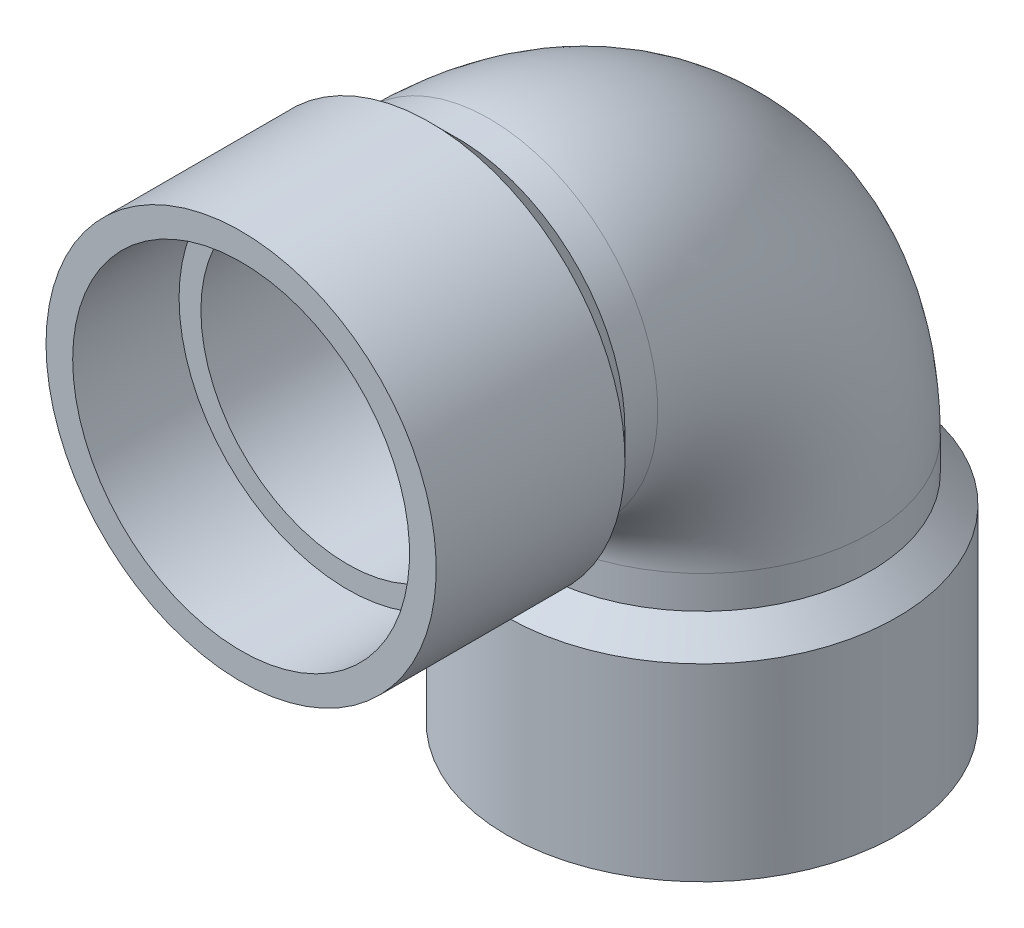
ISO-10303-21;
HEADER;
FILE_DESCRIPTION(('STEP AP214'),'2;1');
FILE_NAME('part.step','',(''),(''),'','','');
FILE_SCHEMA(('AUTOMOTIVE_DESIGN { 1 0 10303 214 1 1 1 1 }'));
ENDSEC;
DATA;
#1=APPLICATION_CONTEXT('core data for automotive mechanical design processes');
#2=APPLICATION_PROTOCOL_DEFINITION('international standard','automotive_design',2000,#1);
#3=PRODUCT_CONTEXT('',#1,'mechanical');
#4=PRODUCT('Part','Part','',(#3));
#5=PRODUCT_RELATED_PRODUCT_CATEGORY('part','',(#4));
#6=PRODUCT_DEFINITION_FORMATION('','',#4);
#7=PRODUCT_DEFINITION_CONTEXT('part definition',#1,'design');
#8=PRODUCT_DEFINITION('design','',#6,#7);
#9=PRODUCT_DEFINITION_SHAPE('','',#8);
#10=(LENGTH_UNIT() NAMED_UNIT(*) SI_UNIT(.MILLI.,.METRE.));
#11=(NAMED_UNIT(*) PLANE_ANGLE_UNIT() SI_UNIT($,.RADIAN.));
#12=(NAMED_UNIT(*) SI_UNIT($,.STERADIAN.) SOLID_ANGLE_UNIT());
#13=UNCERTAINTY_MEASURE_WITH_UNIT(LENGTH_MEASURE(1.E-05),#10,'distance_accuracy_value','');
#14=(GEOMETRIC_REPRESENTATION_CONTEXT(3) GLOBAL_UNCERTAINTY_ASSIGNED_CONTEXT((#13)) GLOBAL_UNIT_ASSIGNED_CONTEXT((#10,
#11,#12)) REPRESENTATION_CONTEXT('',''));
#15=CARTESIAN_POINT('',(0.,0.,0.));
#16=DIRECTION('',(0.,0.,1.));
#17=DIRECTION('',(1.,0.,0.));
#18=AXIS2_PLACEMENT_3D('',#15,#16,#17);
#19=CARTESIAN_POINT('',(0.,-63.5,0.));
#20=DIRECTION('',(0.,1.,0.));
#21=DIRECTION('',(0.,0.,1.));
#22=AXIS2_PLACEMENT_3D('',#19,#20,#21);
#23=CYLINDRICAL_SURFACE('',#22,30.1625);
#24=CARTESIAN_POINT('',(0.,-43.9749999999999,0.));
#25=DIRECTION('',(0.,-1.,0.));
#26=DIRECTION('',(0.,0.,-1.));
#27=AXIS2_PLACEMENT_3D('',#24,#25,#26);
#28=CIRCLE('',#27,30.1625);
#29=CARTESIAN_POINT('',(0.,-43.9749999999999,-30.1625));
#30=VERTEX_POINT('',#29);
#31=EDGE_CURVE('E55',#30,#30,#28,.F.);
#32=ORIENTED_EDGE('',*,*,#31,.T.);
#33=EDGE_LOOP('',(#32));
#34=FACE_BOUND('',#33,.T.);
#35=CARTESIAN_POINT('',(0.,-38.1,0.));
#36=DIRECTION('',(0.,1.,0.));
#37=DIRECTION('',(1.,0.,0.));
#38=AXIS2_PLACEMENT_3D('',#35,#36,#37);
#39=CIRCLE('',#38,30.1625);
#40=CARTESIAN_POINT('',(0.,-38.1,-30.1625));
#41=VERTEX_POINT('',#40);
#42=EDGE_CURVE('E70',#41,#41,#39,.T.);
#43=ORIENTED_EDGE('',*,*,#42,.F.);
#44=EDGE_LOOP('',(#43));
#45=FACE_BOUND('',#44,.T.);
#46=ADVANCED_FACE('F34',(#34,#45),#23,.T.);
#47=CARTESIAN_POINT('',(0.,0.,38.1));
#48=DIRECTION('',(0.,0.,1.));
#49=DIRECTION('',(0.,-1.,0.));
#50=AXIS2_PLACEMENT_3D('',#47,#48,#49);
#51=CYLINDRICAL_SURFACE('',#50,30.1625);
#52=CARTESIAN_POINT('',(0.,0.,43.9749999999999));
#53=DIRECTION('',(0.,0.,1.));
#54=DIRECTION('',(0.,-1.,0.));
#55=AXIS2_PLACEMENT_3D('',#52,#53,#54);
#56=CIRCLE('',#55,30.1625);
#57=CARTESIAN_POINT('',(0.,-30.1625,43.9749999999999));
#58=VERTEX_POINT('',#57);
#59=EDGE_CURVE('E59',#58,#58,#56,.F.);
#60=ORIENTED_EDGE('',*,*,#59,.T.);
#61=EDGE_LOOP('',(#60));
#62=FACE_BOUND('',#61,.T.);
#63=CARTESIAN_POINT('',(0.,0.,38.1));
#64=DIRECTION('',(0.,0.,1.));
#65=DIRECTION('',(1.,0.,0.));
#66=AXIS2_PLACEMENT_3D('',#63,#64,#65);
#67=CIRCLE('',#66,30.1625);
#68=CARTESIAN_POINT('',(0.,30.1625,38.1));
#69=VERTEX_POINT('',#68);
#70=EDGE_CURVE('E69',#69,#69,#67,.T.);
#71=ORIENTED_EDGE('',*,*,#70,.T.);
#72=EDGE_LOOP('',(#71));
#73=FACE_BOUND('',#72,.T.);
#74=ADVANCED_FACE('F91',(#62,#73),#51,.T.);
#75=CARTESIAN_POINT('',(0.,-38.1,38.1));
#76=DIRECTION('',(1.,0.,0.));
#77=DIRECTION('',(0.,0.,-1.));
#78=AXIS2_PLACEMENT_3D('',#75,#76,#77);
#79=TOROIDAL_SURFACE('',#78,38.1,30.1625);
#80=CARTESIAN_POINT('',(0.,-38.1,38.1));
#81=DIRECTION('',(1.,0.,0.));
#82=DIRECTION('',(0.,0.,-1.));
#83=AXIS2_PLACEMENT_3D('',#80,#81,#82);
#84=CIRCLE('',#83,68.2625);
#85=EDGE_CURVE('',#41,#69,#84,.T.);
#86=ORIENTED_EDGE('',*,*,#42,.T.);
#87=ORIENTED_EDGE('',*,*,#70,.F.);
#88=ORIENTED_EDGE('',*,*,#85,.T.);
#89=ORIENTED_EDGE('',*,*,#85,.F.);
#90=EDGE_LOOP('',(#86,#88,#87,#89));
#91=FACE_BOUND('',#90,.T.);
#92=ADVANCED_FACE('F95',(#91),#79,.T.);
#93=CARTESIAN_POINT('',(0.,-63.5,0.));
#94=DIRECTION('',(0.,1.,0.));
#95=DIRECTION('',(1.,0.,0.));
#96=AXIS2_PLACEMENT_3D('',#93,#94,#95);
#97=PLANE('',#96);
#98=CARTESIAN_POINT('',(0.,-63.5,0.));
#99=DIRECTION('',(0.,1.,0.));
#100=DIRECTION('',(1.,0.,0.));
#101=AXIS2_PLACEMENT_3D('',#98,#99,#100);
#102=CIRCLE('',#101,26.2509);
#103=CARTESIAN_POINT('',(26.2509,-63.5,0.));
#104=VERTEX_POINT('',#103);
#105=EDGE_CURVE('E47',#104,#104,#102,.F.);
#106=ORIENTED_EDGE('',*,*,#105,.F.);
#107=EDGE_LOOP('',(#106));
#108=FACE_BOUND('',#107,.T.);
#109=CARTESIAN_POINT('',(0.,-63.5,0.));
#110=DIRECTION('',(0.,1.,0.));
#111=DIRECTION('',(1.,0.,0.));
#112=AXIS2_PLACEMENT_3D('',#109,#110,#111);
#113=CIRCLE('',#112,30.1625);
#114=CARTESIAN_POINT('',(0.,-63.5,30.1625000000002));
#115=VERTEX_POINT('',#114);
#116=EDGE_CURVE('E66',#115,#115,#113,.T.);
#117=ORIENTED_EDGE('',*,*,#116,.F.);
#118=EDGE_LOOP('',(#117));
#119=FACE_BOUND('',#118,.T.);
#120=ADVANCED_FACE('F97',(#108,#119),#97,.F.);
#121=CARTESIAN_POINT('',(0.,0.,63.5));
#122=DIRECTION('',(0.,0.,1.));
#123=DIRECTION('',(1.,0.,0.));
#124=AXIS2_PLACEMENT_3D('',#121,#122,#123);
#125=PLANE('',#124);
#126=CARTESIAN_POINT('',(0.,0.,63.5));
#127=DIRECTION('',(0.,0.,1.));
#128=DIRECTION('',(1.,0.,0.));
#129=AXIS2_PLACEMENT_3D('',#126,#127,#128);
#130=CIRCLE('',#129,26.2509);
#131=CARTESIAN_POINT('',(26.2509,0.,63.5));
#132=VERTEX_POINT('',#131);
#133=EDGE_CURVE('E51',#132,#132,#130,.F.);
#134=ORIENTED_EDGE('',*,*,#133,.T.);
#135=EDGE_LOOP('',(#134));
#136=FACE_BOUND('',#135,.T.);
#137=CARTESIAN_POINT('',(0.,0.,63.5));
#138=DIRECTION('',(0.,0.,1.));
#139=DIRECTION('',(1.,0.,0.));
#140=AXIS2_PLACEMENT_3D('',#137,#138,#139);
#141=CIRCLE('',#140,30.1625);
#142=CARTESIAN_POINT('',(-30.1625,0.,63.5));
#143=VERTEX_POINT('',#142);
#144=EDGE_CURVE('E73',#143,#143,#141,.F.);
#145=ORIENTED_EDGE('',*,*,#144,.F.);
#146=EDGE_LOOP('',(#145));
#147=FACE_BOUND('',#146,.T.);
#148=ADVANCED_FACE('F52',(#136,#147),#125,.T.);
#149=CARTESIAN_POINT('',(0.,-63.5,0.));
#150=DIRECTION('',(0.,1.,0.));
#151=DIRECTION('',(0.,0.,1.));
#152=AXIS2_PLACEMENT_3D('',#149,#150,#151);
#153=CYLINDRICAL_SURFACE('',#152,26.2509);
#154=CARTESIAN_POINT('',(0.,-38.1,0.));
#155=DIRECTION('',(0.,1.,0.));
#156=DIRECTION('',(1.,0.,0.));
#157=AXIS2_PLACEMENT_3D('',#154,#155,#156);
#158=CIRCLE('',#157,26.2509);
#159=CARTESIAN_POINT('',(0.,-38.1,-26.2509));
#160=VERTEX_POINT('',#159);
#161=EDGE_CURVE('E62',#160,#160,#158,.F.);
#162=ORIENTED_EDGE('',*,*,#161,.F.);
#163=EDGE_LOOP('',(#162));
#164=FACE_BOUND('',#163,.T.);
#165=ORIENTED_EDGE('',*,*,#105,.T.);
#166=EDGE_LOOP('',(#165));
#167=FACE_BOUND('',#166,.T.);
#168=ADVANCED_FACE('F128',(#164,#167),#153,.F.);
#169=CARTESIAN_POINT('',(0.,-38.1,38.1));
#170=DIRECTION('',(1.,0.,0.));
#171=DIRECTION('',(0.,0.,-1.));
#172=AXIS2_PLACEMENT_3D('',#169,#170,#171);
#173=TOROIDAL_SURFACE('',#172,38.1,26.2509);
#174=CARTESIAN_POINT('',(0.,0.,38.1));
#175=DIRECTION('',(0.,0.,1.));
#176=DIRECTION('',(1.,0.,0.));
#177=AXIS2_PLACEMENT_3D('',#174,#175,#176);
#178=CIRCLE('',#177,26.2509);
#179=CARTESIAN_POINT('',(0.,26.2509,38.1));
#180=VERTEX_POINT('',#179);
#181=EDGE_CURVE('E56',#180,#180,#178,.F.);
#182=CARTESIAN_POINT('',(0.,-38.1,38.1));
#183=DIRECTION('',(1.,0.,0.));
#184=DIRECTION('',(0.,0.,-1.));
#185=AXIS2_PLACEMENT_3D('',#182,#183,#184);
#186=CIRCLE('',#185,64.3509);
#187=EDGE_CURVE('',#160,#180,#186,.T.);
#188=ORIENTED_EDGE('',*,*,#161,.T.);
#189=ORIENTED_EDGE('',*,*,#181,.F.);
#190=ORIENTED_EDGE('',*,*,#187,.T.);
#191=ORIENTED_EDGE('',*,*,#187,.F.);
#192=EDGE_LOOP('',(#188,#190,#189,#191));
#193=FACE_BOUND('',#192,.T.);
#194=ADVANCED_FACE('F121',(#193),#173,.F.);
#195=CARTESIAN_POINT('',(0.,0.,38.1));
#196=DIRECTION('',(0.,0.,1.));
#197=DIRECTION('',(0.,-1.,0.));
#198=AXIS2_PLACEMENT_3D('',#195,#196,#197);
#199=CYLINDRICAL_SURFACE('',#198,26.2509);
#200=ORIENTED_EDGE('',*,*,#133,.F.);
#201=EDGE_LOOP('',(#200));
#202=FACE_BOUND('',#201,.T.);
#203=ORIENTED_EDGE('',*,*,#181,.T.);
#204=EDGE_LOOP('',(#203));
#205=FACE_BOUND('',#204,.T.);
#206=ADVANCED_FACE('F108',(#202,#205),#199,.F.);
#207=CARTESIAN_POINT('',(0.,0.,82.55));
#208=DIRECTION('',(0.,0.,1.));
#209=DIRECTION('',(1.,0.,0.));
#210=AXIS2_PLACEMENT_3D('',#207,#208,#209);
#211=PLANE('',#210);
#212=CARTESIAN_POINT('',(0.,0.,82.55));
#213=DIRECTION('',(0.,0.,1.));
#214=DIRECTION('',(1.,0.,0.));
#215=AXIS2_PLACEMENT_3D('',#212,#213,#214);
#216=CIRCLE('',#215,34.9377);
#217=CARTESIAN_POINT('',(-34.9377,0.,82.55));
#218=VERTEX_POINT('',#217);
#219=EDGE_CURVE('E231',#218,#218,#216,.T.);
#220=ORIENTED_EDGE('',*,*,#219,.T.);
#221=EDGE_LOOP('',(#220));
#222=FACE_BOUND('',#221,.T.);
#223=CARTESIAN_POINT('',(0.,0.,82.55));
#224=DIRECTION('',(0.,0.,1.));
#225=DIRECTION('',(1.,0.,0.));
#226=AXIS2_PLACEMENT_3D('',#223,#224,#225);
#227=CIRCLE('',#226,30.1625);
#228=CARTESIAN_POINT('',(-30.1625,0.,82.55));
#229=VERTEX_POINT('',#228);
#230=EDGE_CURVE('E232',#229,#229,#227,.T.);
#231=ORIENTED_EDGE('',*,*,#230,.F.);
#232=EDGE_LOOP('',(#231));
#233=FACE_BOUND('',#232,.T.);
#234=ADVANCED_FACE('F100',(#222,#233),#211,.T.);
#235=CARTESIAN_POINT('',(0.,0.,82.55));
#236=DIRECTION('',(0.,0.,-1.));
#237=DIRECTION('',(-1.,0.,0.));
#238=AXIS2_PLACEMENT_3D('',#235,#236,#237);
#239=CYLINDRICAL_SURFACE('',#238,34.9377);
#240=CARTESIAN_POINT('',(0.,0.,48.7501999999999));
#241=DIRECTION('',(0.,0.,1.));
#242=DIRECTION('',(0.,-1.,0.));
#243=AXIS2_PLACEMENT_3D('',#240,#241,#242);
#244=CIRCLE('',#243,34.9377);
#245=CARTESIAN_POINT('',(-34.9377,0.,48.7501999999999));
#246=VERTEX_POINT('',#245);
#247=EDGE_CURVE('E11',#246,#246,#244,.T.);
#248=CARTESIAN_POINT('',(-34.9377,0.,48.7501999999999));
#249=CARTESIAN_POINT('',(-34.9377,0.,49.1022812499999));
#250=CARTESIAN_POINT('',(-34.9377,0.,49.4543624999999));
#251=CARTESIAN_POINT('',(-34.9377,0.,50.1585249999999));
#252=CARTESIAN_POINT('',(-34.9377,0.,50.5106062499999));
#253=CARTESIAN_POINT('',(-34.9377,0.,51.2147687499999));
#254=CARTESIAN_POINT('',(-34.9377,0.,51.5668499999999));
#255=CARTESIAN_POINT('',(-34.9377,0.,52.2710124999999));
#256=CARTESIAN_POINT('',(-34.9377,0.,52.6230937499999));
#257=CARTESIAN_POINT('',(-34.9377,0.,53.3272562499999));
#258=CARTESIAN_POINT('',(-34.9377,0.,53.6793374999999));
#259=CARTESIAN_POINT('',(-34.9377,0.,54.3834999999999));
#260=CARTESIAN_POINT('',(-34.9377,0.,54.7355812499999));
#261=CARTESIAN_POINT('',(-34.9377,0.,55.4397437499999));
#262=CARTESIAN_POINT('',(-34.9377,0.,55.7918249999999));
#263=CARTESIAN_POINT('',(-34.9377,0.,56.4959874999999));
#264=CARTESIAN_POINT('',(-34.9377,0.,56.8480687499999));
#265=CARTESIAN_POINT('',(-34.9377,0.,57.5522312499999));
#266=CARTESIAN_POINT('',(-34.9377,0.,57.9043124999999));
#267=CARTESIAN_POINT('',(-34.9377,0.,58.6084749999999));
#268=CARTESIAN_POINT('',(-34.9377,0.,58.9605562499999));
#269=CARTESIAN_POINT('',(-34.9377,0.,59.6647187499999));
#270=CARTESIAN_POINT('',(-34.9377,0.,60.0167999999999));
#271=CARTESIAN_POINT('',(-34.9377,0.,60.7209624999999));
#272=CARTESIAN_POINT('',(-34.9377,0.,61.0730437499999));
#273=CARTESIAN_POINT('',(-34.9377,0.,61.7772062499999));
#274=CARTESIAN_POINT('',(-34.9377,0.,62.1292874999999));
#275=CARTESIAN_POINT('',(-34.9377,0.,62.8334499999999));
#276=CARTESIAN_POINT('',(-34.9377,0.,63.1855312499999));
#277=CARTESIAN_POINT('',(-34.9377,0.,63.8896937499999));
#278=CARTESIAN_POINT('',(-34.9377,0.,64.2417749999999));
#279=CARTESIAN_POINT('',(-34.9377,0.,64.9459374999999));
#280=CARTESIAN_POINT('',(-34.9377,0.,65.2980187499999));
#281=CARTESIAN_POINT('',(-34.9377,0.,66.0021812499999));
#282=CARTESIAN_POINT('',(-34.9377,0.,66.3542624999999));
#283=CARTESIAN_POINT('',(-34.9377,0.,67.0584249999999));
#284=CARTESIAN_POINT('',(-34.9377,0.,67.4105062499999));
#285=CARTESIAN_POINT('',(-34.9377,0.,68.1146687499999));
#286=CARTESIAN_POINT('',(-34.9377,0.,68.4667499999999));
#287=CARTESIAN_POINT('',(-34.9377,0.,69.1709124999999));
#288=CARTESIAN_POINT('',(-34.9377,0.,69.52299375));
#289=CARTESIAN_POINT('',(-34.9377,0.,70.22715625));
#290=CARTESIAN_POINT('',(-34.9377,0.,70.5792375));
#291=CARTESIAN_POINT('',(-34.9377,0.,71.2834));
#292=CARTESIAN_POINT('',(-34.9377,0.,71.63548125));
#293=CARTESIAN_POINT('',(-34.9377,0.,72.33964375));
#294=CARTESIAN_POINT('',(-34.9377,0.,72.691725));
#295=CARTESIAN_POINT('',(-34.9377,0.,73.3958875));
#296=CARTESIAN_POINT('',(-34.9377,0.,73.74796875));
#297=CARTESIAN_POINT('',(-34.9377,0.,74.45213125));
#298=CARTESIAN_POINT('',(-34.9377,0.,74.8042125));
#299=CARTESIAN_POINT('',(-34.9377,0.,75.508375));
#300=CARTESIAN_POINT('',(-34.9377,0.,75.86045625));
#301=CARTESIAN_POINT('',(-34.9377,0.,76.56461875));
#302=CARTESIAN_POINT('',(-34.9377,0.,76.9167));
#303=CARTESIAN_POINT('',(-34.9377,0.,77.6208625));
#304=CARTESIAN_POINT('',(-34.9377,0.,77.97294375));
#305=CARTESIAN_POINT('',(-34.9377,0.,78.67710625));
#306=CARTESIAN_POINT('',(-34.9377,0.,79.0291875));
#307=CARTESIAN_POINT('',(-34.9377,0.,79.73335));
#308=CARTESIAN_POINT('',(-34.9377,0.,80.08543125));
#309=CARTESIAN_POINT('',(-34.9377,0.,80.78959375));
#310=CARTESIAN_POINT('',(-34.9377,0.,81.141675));
#311=CARTESIAN_POINT('',(-34.9377,0.,81.8458375));
#312=CARTESIAN_POINT('',(-34.9377,0.,82.19791875));
#313=CARTESIAN_POINT('',(-34.9377,0.,82.55));
#314=B_SPLINE_CURVE_WITH_KNOTS('',3,(#248,#249,#250,#251,#252,#253,#254,#255,#256,#257,#258,
#259,#260,#261,#262,#263,#264,#265,#266,#267,#268,#269,#270,#271,#272,#273,#274,#275,#276,#277,
#278,#279,#280,#281,#282,#283,#284,#285,#286,#287,#288,#289,#290,#291,#292,#293,#294,#295,#296,
#297,#298,#299,#300,#301,#302,#303,#304,#305,#306,#307,#308,#309,#310,#311,#312,#313),
.UNSPECIFIED.,.F.,.F.,(4,2,2,2,2,2,2,2,2,2,2,2,2,2,2,2,2,2,2,2,2,2,2,2,2,2,2,2,2,2,2,2,4),(0.,
1.05624375000001,2.11248750000001,3.16873125000001,4.22497500000001,5.28121875000002,
6.33746250000002,7.39370625000002,8.44995000000002,9.50619375000002,10.5624375,11.61868125,
12.674925,13.73116875,14.7874125,15.8436562500001,16.8999,17.9561437500001,19.0123875000001,
20.0686312500001,21.1248750000001,22.1811187500001,23.2373625000001,24.2936062500001,
25.3498500000001,26.4060937500001,27.4623375000001,28.5185812500001,29.5748250000001,
30.6310687500001,31.6873125000001,32.7435562500001,33.7998000000001),.UNSPECIFIED.);
#315=EDGE_CURVE('BSEAM111',#246,#218,#314,.T.);
#316=ORIENTED_EDGE('',*,*,#247,.T.);
#317=ORIENTED_EDGE('',*,*,#219,.F.);
#318=ORIENTED_EDGE('',*,*,#315,.T.);
#319=ORIENTED_EDGE('',*,*,#315,.F.);
#320=EDGE_LOOP('',(#316,#318,#317,#319));
#321=FACE_BOUND('',#320,.T.);
#322=ADVANCED_FACE('F111',(#321),#239,.T.);
#323=CARTESIAN_POINT('',(0.,0.,82.55));
#324=DIRECTION('',(0.,0.,-1.));
#325=DIRECTION('',(-1.,0.,0.));
#326=AXIS2_PLACEMENT_3D('',#323,#324,#325);
#327=CYLINDRICAL_SURFACE('',#326,30.1625);
#328=CARTESIAN_POINT('',(-30.1625,0.,63.5));
#329=CARTESIAN_POINT('',(-30.1625,0.,63.6984375));
#330=CARTESIAN_POINT('',(-30.1625,0.,63.896875));
#331=CARTESIAN_POINT('',(-30.1625,0.,64.29375));
#332=CARTESIAN_POINT('',(-30.1625,0.,64.4921875));
#333=CARTESIAN_POINT('',(-30.1625,0.,64.8890625));
#334=CARTESIAN_POINT('',(-30.1625,0.,65.0875));
#335=CARTESIAN_POINT('',(-30.1625,0.,65.484375));
#336=CARTESIAN_POINT('',(-30.1625,0.,65.6828125));
#337=CARTESIAN_POINT('',(-30.1625,0.,66.0796875));
#338=CARTESIAN_POINT('',(-30.1625,0.,66.278125));
#339=CARTESIAN_POINT('',(-30.1625,0.,66.675));
#340=CARTESIAN_POINT('',(-30.1625,0.,66.8734375));
#341=CARTESIAN_POINT('',(-30.1625,0.,67.2703125));
#342=CARTESIAN_POINT('',(-30.1625,0.,67.46875));
#343=CARTESIAN_POINT('',(-30.1625,0.,67.865625));
#344=CARTESIAN_POINT('',(-30.1625,0.,68.0640625));
#345=CARTESIAN_POINT('',(-30.1625,0.,68.4609375));
#346=CARTESIAN_POINT('',(-30.1625,0.,68.659375));
#347=CARTESIAN_POINT('',(-30.1625,0.,69.05625));
#348=CARTESIAN_POINT('',(-30.1625,0.,69.2546875));
#349=CARTESIAN_POINT('',(-30.1625,0.,69.6515625));
#350=CARTESIAN_POINT('',(-30.1625,0.,69.85));
#351=CARTESIAN_POINT('',(-30.1625,0.,70.246875));
#352=CARTESIAN_POINT('',(-30.1625,0.,70.4453125));
#353=CARTESIAN_POINT('',(-30.1625,0.,70.8421875));
#354=CARTESIAN_POINT('',(-30.1625,0.,71.040625));
#355=CARTESIAN_POINT('',(-30.1625,0.,71.4375));
#356=CARTESIAN_POINT('',(-30.1625,0.,71.6359375));
#357=CARTESIAN_POINT('',(-30.1625,0.,72.0328125));
#358=CARTESIAN_POINT('',(-30.1625,0.,72.23125));
#359=CARTESIAN_POINT('',(-30.1625,0.,72.628125));
#360=CARTESIAN_POINT('',(-30.1625,0.,72.8265625));
#361=CARTESIAN_POINT('',(-30.1625,0.,73.2234375));
#362=CARTESIAN_POINT('',(-30.1625,0.,73.421875));
#363=CARTESIAN_POINT('',(-30.1625,0.,73.81875));
#364=CARTESIAN_POINT('',(-30.1625,0.,74.0171875));
#365=CARTESIAN_POINT('',(-30.1625,0.,74.4140625));
#366=CARTESIAN_POINT('',(-30.1625,0.,74.6125));
#367=CARTESIAN_POINT('',(-30.1625,0.,75.009375));
#368=CARTESIAN_POINT('',(-30.1625,0.,75.2078125));
#369=CARTESIAN_POINT('',(-30.1625,0.,75.6046875));
#370=CARTESIAN_POINT('',(-30.1625,0.,75.803125));
#371=CARTESIAN_POINT('',(-30.1625,0.,76.2));
#372=CARTESIAN_POINT('',(-30.1625,0.,76.3984375));
#373=CARTESIAN_POINT('',(-30.1625,0.,76.7953125));
#374=CARTESIAN_POINT('',(-30.1625,0.,76.99375));
#375=CARTESIAN_POINT('',(-30.1625,0.,77.390625));
#376=CARTESIAN_POINT('',(-30.1625,0.,77.5890625));
#377=CARTESIAN_POINT('',(-30.1625,0.,77.9859375));
#378=CARTESIAN_POINT('',(-30.1625,0.,78.184375));
#379=CARTESIAN_POINT('',(-30.1625,0.,78.58125));
#380=CARTESIAN_POINT('',(-30.1625,0.,78.7796875));
#381=CARTESIAN_POINT('',(-30.1625,0.,79.1765625));
#382=CARTESIAN_POINT('',(-30.1625,0.,79.375));
#383=CARTESIAN_POINT('',(-30.1625,0.,79.771875));
#384=CARTESIAN_POINT('',(-30.1625,0.,79.9703125));
#385=CARTESIAN_POINT('',(-30.1625,0.,80.3671875));
#386=CARTESIAN_POINT('',(-30.1625,0.,80.565625));
#387=CARTESIAN_POINT('',(-30.1625,0.,80.9625));
#388=CARTESIAN_POINT('',(-30.1625,0.,81.1609375));
#389=CARTESIAN_POINT('',(-30.1625,0.,81.5578125));
#390=CARTESIAN_POINT('',(-30.1625,0.,81.75625));
#391=CARTESIAN_POINT('',(-30.1625,0.,82.153125));
#392=CARTESIAN_POINT('',(-30.1625,0.,82.3515625));
#393=CARTESIAN_POINT('',(-30.1625,0.,82.55));
#394=B_SPLINE_CURVE_WITH_KNOTS('',3,(#328,#329,#330,#331,#332,#333,#334,#335,#336,#337,#338,
#339,#340,#341,#342,#343,#344,#345,#346,#347,#348,#349,#350,#351,#352,#353,#354,#355,#356,#357,
#358,#359,#360,#361,#362,#363,#364,#365,#366,#367,#368,#369,#370,#371,#372,#373,#374,#375,#376,
#377,#378,#379,#380,#381,#382,#383,#384,#385,#386,#387,#388,#389,#390,#391,#392,#393),
.UNSPECIFIED.,.F.,.F.,(4,2,2,2,2,2,2,2,2,2,2,2,2,2,2,2,2,2,2,2,2,2,2,2,2,2,2,2,2,2,2,2,4),(0.,
0.5953125,1.190625,1.7859375,2.38125,2.9765625,3.571875,4.1671875,4.7625,5.3578125,5.953125,
6.5484375,7.14375,7.7390625,8.334375,8.92968750000001,9.52500000000001,10.1203125,10.715625,
11.3109375,11.90625,12.5015625,13.096875,13.6921875,14.2875,14.8828125,15.478125,16.0734375,
16.66875,17.2640625,17.859375,18.4546875,19.05),.UNSPECIFIED.);
#395=EDGE_CURVE('BSEAM118',#143,#229,#394,.T.);
#396=ORIENTED_EDGE('',*,*,#144,.T.);
#397=ORIENTED_EDGE('',*,*,#230,.T.);
#398=ORIENTED_EDGE('',*,*,#395,.T.);
#399=ORIENTED_EDGE('',*,*,#395,.F.);
#400=EDGE_LOOP('',(#396,#398,#397,#399));
#401=FACE_BOUND('',#400,.T.);
#402=ADVANCED_FACE('F118',(#401),#327,.F.);
#403=CARTESIAN_POINT('',(0.,-82.55,2.99970536394074E-13));
#404=DIRECTION('',(0.,1.,0.));
#405=DIRECTION('',(0.,0.,1.));
#406=AXIS2_PLACEMENT_3D('',#403,#404,#405);
#407=CYLINDRICAL_SURFACE('',#406,30.1625);
#408=CARTESIAN_POINT('',(0.,-82.55,2.99970536394074E-13));
#409=DIRECTION('',(0.,1.,0.));
#410=DIRECTION('',(1.,0.,0.));
#411=AXIS2_PLACEMENT_3D('',#408,#409,#410);
#412=CIRCLE('',#411,30.1625);
#413=CARTESIAN_POINT('',(0.,-82.5499999999999,30.1625000000003));
#414=VERTEX_POINT('',#413);
#415=EDGE_CURVE('E247',#414,#414,#412,.T.);
#416=CARTESIAN_POINT('',(0.,-82.5499999999999,30.1625000000003));
#417=CARTESIAN_POINT('',(0.,-82.3515624999999,30.1625000000003));
#418=CARTESIAN_POINT('',(0.,-82.1531249999999,30.1625000000003));
#419=CARTESIAN_POINT('',(0.,-81.7562499999999,30.1625000000003));
#420=CARTESIAN_POINT('',(0.,-81.5578124999999,30.1625000000003));
#421=CARTESIAN_POINT('',(0.,-81.1609374999999,30.1625000000003));
#422=CARTESIAN_POINT('',(0.,-80.9624999999999,30.1625000000003));
#423=CARTESIAN_POINT('',(0.,-80.5656249999999,30.1625000000003));
#424=CARTESIAN_POINT('',(0.,-80.3671874999999,30.1625000000003));
#425=CARTESIAN_POINT('',(0.,-79.9703124999999,30.1625000000003));
#426=CARTESIAN_POINT('',(0.,-79.7718749999999,30.1625000000003));
#427=CARTESIAN_POINT('',(0.,-79.3749999999999,30.1625000000003));
#428=CARTESIAN_POINT('',(0.,-79.1765624999999,30.1625000000003));
#429=CARTESIAN_POINT('',(0.,-78.7796874999999,30.1625000000003));
#430=CARTESIAN_POINT('',(0.,-78.5812499999999,30.1625000000003));
#431=CARTESIAN_POINT('',(0.,-78.1843749999999,30.1625000000003));
#432=CARTESIAN_POINT('',(0.,-77.9859374999999,30.1625000000003));
#433=CARTESIAN_POINT('',(0.,-77.5890624999999,30.1625000000003));
#434=CARTESIAN_POINT('',(0.,-77.3906249999999,30.1625000000003));
#435=CARTESIAN_POINT('',(0.,-76.9937499999999,30.1625000000003));
#436=CARTESIAN_POINT('',(0.,-76.7953124999999,30.1625000000003));
#437=CARTESIAN_POINT('',(0.,-76.3984374999999,30.1625000000003));
#438=CARTESIAN_POINT('',(0.,-76.1999999999999,30.1625000000003));
#439=CARTESIAN_POINT('',(0.,-75.8031249999999,30.1625000000003));
#440=CARTESIAN_POINT('',(0.,-75.6046874999999,30.1625000000003));
#441=CARTESIAN_POINT('',(0.,-75.2078124999999,30.1625000000003));
#442=CARTESIAN_POINT('',(0.,-75.0093749999999,30.1625000000003));
#443=CARTESIAN_POINT('',(0.,-74.6124999999999,30.1625000000003));
#444=CARTESIAN_POINT('',(0.,-74.4140624999999,30.1625000000003));
#445=CARTESIAN_POINT('',(0.,-74.0171874999999,30.1625000000003));
#446=CARTESIAN_POINT('',(0.,-73.8187499999999,30.1625000000003));
#447=CARTESIAN_POINT('',(0.,-73.4218749999999,30.1625000000003));
#448=CARTESIAN_POINT('',(0.,-73.2234374999999,30.1625000000003));
#449=CARTESIAN_POINT('',(0.,-72.8265624999999,30.1625000000003));
#450=CARTESIAN_POINT('',(0.,-72.6281249999999,30.1625000000003));
#451=CARTESIAN_POINT('',(0.,-72.23125,30.1625000000003));
#452=CARTESIAN_POINT('',(0.,-72.0328124999999,30.1625000000003));
#453=CARTESIAN_POINT('',(0.,-71.6359375,30.1625000000003));
#454=CARTESIAN_POINT('',(0.,-71.4374999999999,30.1625000000003));
#455=CARTESIAN_POINT('',(0.,-71.0406249999999,30.1625000000003));
#456=CARTESIAN_POINT('',(0.,-70.8421875,30.1625000000003));
#457=CARTESIAN_POINT('',(0.,-70.4453125,30.1625000000003));
#458=CARTESIAN_POINT('',(0.,-70.2468749999999,30.1625000000003));
#459=CARTESIAN_POINT('',(0.,-69.85,30.1625000000003));
#460=CARTESIAN_POINT('',(0.,-69.6515625,30.1625000000003));
#461=CARTESIAN_POINT('',(0.,-69.2546875,30.1625000000003));
#462=CARTESIAN_POINT('',(0.,-69.05625,30.1625000000003));
#463=CARTESIAN_POINT('',(0.,-68.659375,30.1625000000003));
#464=CARTESIAN_POINT('',(0.,-68.4609375,30.1625000000003));
#465=CARTESIAN_POINT('',(0.,-68.0640625,30.1625000000003));
#466=CARTESIAN_POINT('',(0.,-67.865625,30.1625000000003));
#467=CARTESIAN_POINT('',(0.,-67.46875,30.1625000000003));
#468=CARTESIAN_POINT('',(0.,-67.2703125,30.1625000000002));
#469=CARTESIAN_POINT('',(0.,-66.8734375,30.1625000000002));
#470=CARTESIAN_POINT('',(0.,-66.675,30.1625000000002));
#471=CARTESIAN_POINT('',(0.,-66.278125,30.1625000000002));
#472=CARTESIAN_POINT('',(0.,-66.0796875,30.1625000000002));
#473=CARTESIAN_POINT('',(0.,-65.6828125,30.1625000000002));
#474=CARTESIAN_POINT('',(0.,-65.484375,30.1625000000002));
#475=CARTESIAN_POINT('',(0.,-65.0875,30.1625000000002));
#476=CARTESIAN_POINT('',(0.,-64.8890625,30.1625000000002));
#477=CARTESIAN_POINT('',(0.,-64.4921875,30.1625000000002));
#478=CARTESIAN_POINT('',(0.,-64.29375,30.1625000000002));
#479=CARTESIAN_POINT('',(0.,-63.896875,30.1625000000002));
#480=CARTESIAN_POINT('',(0.,-63.6984375,30.1625000000002));
#481=CARTESIAN_POINT('',(0.,-63.5,30.1625000000002));
#482=B_SPLINE_CURVE_WITH_KNOTS('',3,(#416,#417,#418,#419,#420,#421,#422,#423,#424,#425,#426,
#427,#428,#429,#430,#431,#432,#433,#434,#435,#436,#437,#438,#439,#440,#441,#442,#443,#444,#445,
#446,#447,#448,#449,#450,#451,#452,#453,#454,#455,#456,#457,#458,#459,#460,#461,#462,#463,#464,
#465,#466,#467,#468,#469,#470,#471,#472,#473,#474,#475,#476,#477,#478,#479,#480,#481),
.UNSPECIFIED.,.F.,.F.,(4,2,2,2,2,2,2,2,2,2,2,2,2,2,2,2,2,2,2,2,2,2,2,2,2,2,2,2,2,2,2,2,4),(0.,
0.5953125,1.190625,1.7859375,2.38125,2.97656249999999,3.57187499999999,4.16718749999999,
4.76249999999999,5.35781249999998,5.95312499999998,6.54843749999998,7.14374999999998,
7.73906249999996,8.33437499999996,8.92968749999996,9.52499999999996,10.1203125,10.715625,
11.3109375,11.90625,12.5015625,13.0968749999999,13.6921874999999,14.2874999999999,
14.8828124999999,15.4781249999999,16.0734374999999,16.6687499999999,17.2640624999999,
17.8593749999999,18.4546874999999,19.0499999999999),.UNSPECIFIED.);
#483=EDGE_CURVE('BSEAM180',#414,#115,#482,.T.);
#484=ORIENTED_EDGE('',*,*,#415,.F.);
#485=ORIENTED_EDGE('',*,*,#116,.T.);
#486=ORIENTED_EDGE('',*,*,#483,.T.);
#487=ORIENTED_EDGE('',*,*,#483,.F.);
#488=EDGE_LOOP('',(#484,#486,#485,#487));
#489=FACE_BOUND('',#488,.T.);
#490=ADVANCED_FACE('F180',(#489),#407,.F.);
#491=CARTESIAN_POINT('',(0.,-82.55,2.99970536394074E-13));
#492=DIRECTION('',(0.,1.,0.));
#493=DIRECTION('',(0.,0.,1.));
#494=AXIS2_PLACEMENT_3D('',#491,#492,#493);
#495=CYLINDRICAL_SURFACE('',#494,34.9377);
#496=CARTESIAN_POINT('',(0.,-48.7501999999999,0.));
#497=DIRECTION('',(0.,-1.,0.));
#498=DIRECTION('',(0.,0.,-1.));
#499=AXIS2_PLACEMENT_3D('',#496,#497,#498);
#500=CIRCLE('',#499,34.9377);
#501=CARTESIAN_POINT('',(0.,-48.7501999999999,34.9377000000002));
#502=VERTEX_POINT('',#501);
#503=EDGE_CURVE('E42',#502,#502,#500,.T.);
#504=CARTESIAN_POINT('',(0.,-82.55,2.99970536394074E-13));
#505=DIRECTION('',(0.,1.,0.));
#506=DIRECTION('',(1.,0.,0.));
#507=AXIS2_PLACEMENT_3D('',#504,#505,#506);
#508=CIRCLE('',#507,34.9377);
#509=CARTESIAN_POINT('',(0.,-82.5499999999999,34.9377000000003));
#510=VERTEX_POINT('',#509);
#511=EDGE_CURVE('E237',#510,#510,#508,.T.);
#512=CARTESIAN_POINT('',(0.,-48.7501999999999,34.9377000000002));
#513=CARTESIAN_POINT('',(0.,-49.1022812499999,34.9377000000002));
#514=CARTESIAN_POINT('',(0.,-49.4543624999999,34.9377000000002));
#515=CARTESIAN_POINT('',(0.,-50.1585249999999,34.9377000000002));
#516=CARTESIAN_POINT('',(0.,-50.5106062499999,34.9377000000002));
#517=CARTESIAN_POINT('',(0.,-51.2147687499999,34.9377000000002));
#518=CARTESIAN_POINT('',(0.,-51.5668499999999,34.9377000000002));
#519=CARTESIAN_POINT('',(0.,-52.2710124999999,34.9377000000002));
#520=CARTESIAN_POINT('',(0.,-52.6230937499999,34.9377000000002));
#521=CARTESIAN_POINT('',(0.,-53.3272562499999,34.9377000000002));
#522=CARTESIAN_POINT('',(0.,-53.6793374999999,34.9377000000002));
#523=CARTESIAN_POINT('',(0.,-54.3834999999999,34.9377000000002));
#524=CARTESIAN_POINT('',(0.,-54.7355812499999,34.9377000000002));
#525=CARTESIAN_POINT('',(0.,-55.4397437499999,34.9377000000002));
#526=CARTESIAN_POINT('',(0.,-55.7918249999999,34.9377000000002));
#527=CARTESIAN_POINT('',(0.,-56.4959874999999,34.9377000000002));
#528=CARTESIAN_POINT('',(0.,-56.8480687499999,34.9377000000002));
#529=CARTESIAN_POINT('',(0.,-57.5522312499999,34.9377000000002));
#530=CARTESIAN_POINT('',(0.,-57.9043124999999,34.9377000000002));
#531=CARTESIAN_POINT('',(0.,-58.6084749999999,34.9377000000002));
#532=CARTESIAN_POINT('',(0.,-58.9605562499999,34.9377000000002));
#533=CARTESIAN_POINT('',(0.,-59.6647187499999,34.9377000000002));
#534=CARTESIAN_POINT('',(0.,-60.0167999999999,34.9377000000002));
#535=CARTESIAN_POINT('',(0.,-60.7209624999999,34.9377000000002));
#536=CARTESIAN_POINT('',(0.,-61.0730437499999,34.9377000000002));
#537=CARTESIAN_POINT('',(0.,-61.7772062499999,34.9377000000002));
#538=CARTESIAN_POINT('',(0.,-62.1292874999999,34.9377000000002));
#539=CARTESIAN_POINT('',(0.,-62.8334499999999,34.9377000000002));
#540=CARTESIAN_POINT('',(0.,-63.1855312499999,34.9377000000002));
#541=CARTESIAN_POINT('',(0.,-63.8896937499999,34.9377000000002));
#542=CARTESIAN_POINT('',(0.,-64.2417749999999,34.9377000000002));
#543=CARTESIAN_POINT('',(0.,-64.9459374999999,34.9377000000002));
#544=CARTESIAN_POINT('',(0.,-65.2980187499999,34.9377000000003));
#545=CARTESIAN_POINT('',(0.,-66.0021812499999,34.9377000000003));
#546=CARTESIAN_POINT('',(0.,-66.3542624999999,34.9377000000003));
#547=CARTESIAN_POINT('',(0.,-67.0584249999999,34.9377000000003));
#548=CARTESIAN_POINT('',(0.,-67.4105062499999,34.9377000000003));
#549=CARTESIAN_POINT('',(0.,-68.1146687499999,34.9377000000003));
#550=CARTESIAN_POINT('',(0.,-68.4667499999999,34.9377000000003));
#551=CARTESIAN_POINT('',(0.,-69.1709124999999,34.9377000000003));
#552=CARTESIAN_POINT('',(0.,-69.5229937499999,34.9377000000003));
#553=CARTESIAN_POINT('',(0.,-70.2271562499999,34.9377000000003));
#554=CARTESIAN_POINT('',(0.,-70.5792374999999,34.9377000000003));
#555=CARTESIAN_POINT('',(0.,-71.2833999999999,34.9377000000003));
#556=CARTESIAN_POINT('',(0.,-71.6354812499999,34.9377000000003));
#557=CARTESIAN_POINT('',(0.,-72.3396437499999,34.9377000000003));
#558=CARTESIAN_POINT('',(0.,-72.6917249999999,34.9377000000003));
#559=CARTESIAN_POINT('',(0.,-73.3958874999999,34.9377000000003));
#560=CARTESIAN_POINT('',(0.,-73.7479687499999,34.9377000000003));
#561=CARTESIAN_POINT('',(0.,-74.4521312499999,34.9377000000003));
#562=CARTESIAN_POINT('',(0.,-74.8042124999999,34.9377000000003));
#563=CARTESIAN_POINT('',(0.,-75.5083749999999,34.9377000000003));
#564=CARTESIAN_POINT('',(0.,-75.8604562499999,34.9377000000003));
#565=CARTESIAN_POINT('',(0.,-76.5646187499999,34.9377000000003));
#566=CARTESIAN_POINT('',(0.,-76.9166999999999,34.9377000000003));
#567=CARTESIAN_POINT('',(0.,-77.6208624999999,34.9377000000003));
#568=CARTESIAN_POINT('',(0.,-77.9729437499999,34.9377000000003));
#569=CARTESIAN_POINT('',(0.,-78.6771062499999,34.9377000000003));
#570=CARTESIAN_POINT('',(0.,-79.0291874999999,34.9377000000003));
#571=CARTESIAN_POINT('',(0.,-79.7333499999999,34.9377000000003));
#572=CARTESIAN_POINT('',(0.,-80.0854312499999,34.9377000000003));
#573=CARTESIAN_POINT('',(0.,-80.7895937499999,34.9377000000003));
#574=CARTESIAN_POINT('',(0.,-81.1416749999999,34.9377000000003));
#575=CARTESIAN_POINT('',(0.,-81.8458374999999,34.9377000000003));
#576=CARTESIAN_POINT('',(0.,-82.1979187499999,34.9377000000003));
#577=CARTESIAN_POINT('',(0.,-82.5499999999999,34.9377000000003));
#578=B_SPLINE_CURVE_WITH_KNOTS('',3,(#512,#513,#514,#515,#516,#517,#518,#519,#520,#521,#522,
#523,#524,#525,#526,#527,#528,#529,#530,#531,#532,#533,#534,#535,#536,#537,#538,#539,#540,#541,
#542,#543,#544,#545,#546,#547,#548,#549,#550,#551,#552,#553,#554,#555,#556,#557,#558,#559,#560,
#561,#562,#563,#564,#565,#566,#567,#568,#569,#570,#571,#572,#573,#574,#575,#576,#577),
.UNSPECIFIED.,.F.,.F.,(4,2,2,2,2,2,2,2,2,2,2,2,2,2,2,2,2,2,2,2,2,2,2,2,2,2,2,2,2,2,2,2,4),(0.,
1.05624375,2.1124875,3.16873124999999,4.22497499999998,5.28121874999999,6.33746249999998,
7.39370624999999,8.44994999999998,9.50619374999998,10.5624375,11.61868125,12.674925,13.73116875,
14.7874125,15.84365625,16.8999,17.95614375,19.0123875,20.06863125,21.124875,22.18111875,
23.2373624999999,24.29360625,25.34985,26.40609375,27.4623375,28.5185812499999,29.574825,
30.6310687499999,31.6873124999999,32.7435562499999,33.7997999999999),.UNSPECIFIED.);
#579=EDGE_CURVE('BSEAM80',#502,#510,#578,.T.);
#580=ORIENTED_EDGE('',*,*,#503,.T.);
#581=ORIENTED_EDGE('',*,*,#511,.T.);
#582=ORIENTED_EDGE('',*,*,#579,.T.);
#583=ORIENTED_EDGE('',*,*,#579,.F.);
#584=EDGE_LOOP('',(#580,#582,#581,#583));
#585=FACE_BOUND('',#584,.T.);
#586=ADVANCED_FACE('F80',(#585),#495,.T.);
#587=CARTESIAN_POINT('',(0.,-82.55,2.99970536394074E-13));
#588=DIRECTION('',(0.,-1.,0.));
#589=DIRECTION('',(1.,0.,0.));
#590=AXIS2_PLACEMENT_3D('',#587,#588,#589);
#591=PLANE('',#590);
#592=ORIENTED_EDGE('',*,*,#415,.T.);
#593=EDGE_LOOP('',(#592));
#594=FACE_BOUND('',#593,.T.);
#595=ORIENTED_EDGE('',*,*,#511,.F.);
#596=EDGE_LOOP('',(#595));
#597=FACE_BOUND('',#596,.T.);
#598=ADVANCED_FACE('F86',(#594,#597),#591,.T.);
#599=CARTESIAN_POINT('',(0.,-43.9749999999999,0.));
#600=DIRECTION('',(0.,-1.,0.));
#601=DIRECTION('',(0.,0.,-1.));
#602=AXIS2_PLACEMENT_3D('',#599,#600,#601);
#603=CONICAL_SURFACE('',#602,30.1625,0.785398163397445);
#604=ORIENTED_EDGE('',*,*,#503,.F.);
#605=EDGE_LOOP('',(#604));
#606=FACE_BOUND('',#605,.T.);
#607=ORIENTED_EDGE('',*,*,#31,.F.);
#608=EDGE_LOOP('',(#607));
#609=FACE_BOUND('',#608,.T.);
#610=ADVANCED_FACE('F83',(#606,#609),#603,.T.);
#611=CARTESIAN_POINT('',(0.,0.,53.975));
#612=DIRECTION('',(0.,0.,1.));
#613=DIRECTION('',(0.,-1.,0.));
#614=AXIS2_PLACEMENT_3D('',#611,#612,#613);
#615=CONICAL_SURFACE('',#614,40.1625000000002,0.785398163397453);
#616=ORIENTED_EDGE('',*,*,#59,.F.);
#617=EDGE_LOOP('',(#616));
#618=FACE_BOUND('',#617,.T.);
#619=ORIENTED_EDGE('',*,*,#247,.F.);
#620=EDGE_LOOP('',(#619));
#621=FACE_BOUND('',#620,.T.);
#622=ADVANCED_FACE('F36',(#618,#621),#615,.T.);
#623=CLOSED_SHELL('',(#46,#74,#92,#120,#148,#168,#194,#206,#234,#322,#402,#490,#586,#598,#610,#622));
#624=MANIFOLD_SOLID_BREP('B2',#623);
#625=ADVANCED_BREP_SHAPE_REPRESENTATION('',(#18,#624),#14);
#626=SHAPE_DEFINITION_REPRESENTATION(#9,#625);
ENDSEC;
END-ISO-10303-21;
